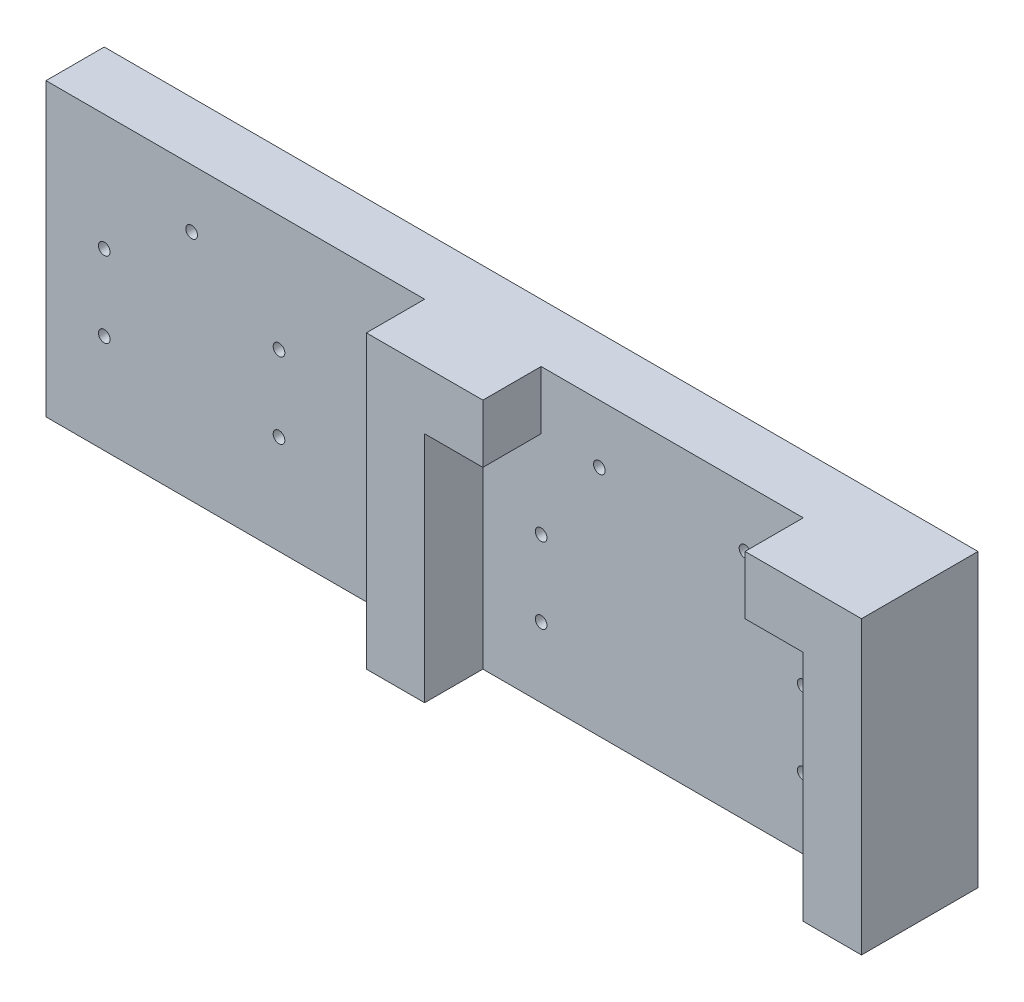
ISO-10303-21;
HEADER;
FILE_DESCRIPTION(('STEP AP214'),'2;1');
FILE_NAME('part.step','',(''),(''),'','','');
FILE_SCHEMA(('AUTOMOTIVE_DESIGN { 1 0 10303 214 1 1 1 1 }'));
ENDSEC;
DATA;
#1=APPLICATION_CONTEXT('core data for automotive mechanical design processes');
#2=APPLICATION_PROTOCOL_DEFINITION('international standard','automotive_design',2000,#1);
#3=PRODUCT_CONTEXT('',#1,'mechanical');
#4=PRODUCT('Part','Part','',(#3));
#5=PRODUCT_RELATED_PRODUCT_CATEGORY('part','',(#4));
#6=PRODUCT_DEFINITION_FORMATION('','',#4);
#7=PRODUCT_DEFINITION_CONTEXT('part definition',#1,'design');
#8=PRODUCT_DEFINITION('design','',#6,#7);
#9=PRODUCT_DEFINITION_SHAPE('','',#8);
#10=(LENGTH_UNIT() NAMED_UNIT(*) SI_UNIT(.MILLI.,.METRE.));
#11=(NAMED_UNIT(*) PLANE_ANGLE_UNIT() SI_UNIT($,.RADIAN.));
#12=(NAMED_UNIT(*) SI_UNIT($,.STERADIAN.) SOLID_ANGLE_UNIT());
#13=UNCERTAINTY_MEASURE_WITH_UNIT(LENGTH_MEASURE(1.E-05),#10,'distance_accuracy_value','');
#14=(GEOMETRIC_REPRESENTATION_CONTEXT(3) GLOBAL_UNCERTAINTY_ASSIGNED_CONTEXT((#13)) GLOBAL_UNIT_ASSIGNED_CONTEXT((#10,
#11,#12)) REPRESENTATION_CONTEXT('',''));
#15=CARTESIAN_POINT('',(0.,0.,0.));
#16=DIRECTION('',(0.,0.,1.));
#17=DIRECTION('',(1.,0.,0.));
#18=AXIS2_PLACEMENT_3D('',#15,#16,#17);
#19=CARTESIAN_POINT('',(0.,0.,-20.));
#20=DIRECTION('',(0.,0.,1.));
#21=DIRECTION('',(1.,0.,0.));
#22=AXIS2_PLACEMENT_3D('',#19,#20,#21);
#23=PLANE('',#22);
#24=CARTESIAN_POINT('',(-1.14143416171165,-128.46417829769,-20.));
#25=DIRECTION('',(0.,0.,-1.));
#26=DIRECTION('',(-1.,0.,0.));
#27=AXIS2_PLACEMENT_3D('',#24,#25,#26);
#28=CIRCLE('',#27,1.);
#29=CARTESIAN_POINT('',(-2.14143416171165,-128.46417829769,-20.));
#30=VERTEX_POINT('',#29);
#31=EDGE_CURVE('E245',#30,#30,#28,.T.);
#32=ORIENTED_EDGE('',*,*,#31,.T.);
#33=EDGE_LOOP('',(#32));
#34=FACE_BOUND('',#33,.T.);
#35=CARTESIAN_POINT('',(8.85856583828836,-100.46417829769,-20.));
#36=DIRECTION('',(0.,0.,-1.));
#37=DIRECTION('',(-1.,0.,0.));
#38=AXIS2_PLACEMENT_3D('',#35,#36,#37);
#39=CIRCLE('',#38,0.999999999999997);
#40=CARTESIAN_POINT('',(7.85856583828836,-100.46417829769,-20.));
#41=VERTEX_POINT('',#40);
#42=EDGE_CURVE('E257',#41,#41,#39,.T.);
#43=ORIENTED_EDGE('',*,*,#42,.T.);
#44=EDGE_LOOP('',(#43));
#45=FACE_BOUND('',#44,.T.);
#46=CARTESIAN_POINT('',(43.8585658382884,-115.46417829769,-20.));
#47=DIRECTION('',(0.,0.,-1.));
#48=DIRECTION('',(-1.,0.,0.));
#49=AXIS2_PLACEMENT_3D('',#46,#47,#48);
#50=CIRCLE('',#49,0.999999999999998);
#51=CARTESIAN_POINT('',(42.8585658382884,-115.46417829769,-20.));
#52=VERTEX_POINT('',#51);
#53=EDGE_CURVE('E269',#52,#52,#50,.T.);
#54=ORIENTED_EDGE('',*,*,#53,.T.);
#55=EDGE_LOOP('',(#54));
#56=FACE_BOUND('',#55,.T.);
#57=CARTESIAN_POINT('',(43.8585658382884,-128.46417829769,-20.));
#58=DIRECTION('',(0.,0.,-1.));
#59=DIRECTION('',(-1.,0.,0.));
#60=AXIS2_PLACEMENT_3D('',#57,#58,#59);
#61=CIRCLE('',#60,1.00000000000001);
#62=CARTESIAN_POINT('',(42.8585658382884,-128.46417829769,-20.));
#63=VERTEX_POINT('',#62);
#64=EDGE_CURVE('E275',#63,#63,#61,.T.);
#65=ORIENTED_EDGE('',*,*,#64,.T.);
#66=EDGE_LOOP('',(#65));
#67=FACE_BOUND('',#66,.T.);
#68=CARTESIAN_POINT('',(33.8585658382884,-100.46417829769,-20.));
#69=DIRECTION('',(0.,0.,-1.));
#70=DIRECTION('',(-1.,0.,0.));
#71=AXIS2_PLACEMENT_3D('',#68,#69,#70);
#72=CIRCLE('',#71,1.00000000000001);
#73=CARTESIAN_POINT('',(32.8585658382884,-100.46417829769,-20.));
#74=VERTEX_POINT('',#73);
#75=EDGE_CURVE('E263',#74,#74,#72,.T.);
#76=ORIENTED_EDGE('',*,*,#75,.T.);
#77=EDGE_LOOP('',(#76));
#78=FACE_BOUND('',#77,.T.);
#79=CARTESIAN_POINT('',(-1.14143416171163,-115.46417829769,-20.));
#80=DIRECTION('',(0.,0.,-1.));
#81=DIRECTION('',(-1.,0.,0.));
#82=AXIS2_PLACEMENT_3D('',#79,#80,#81);
#83=CIRCLE('',#82,0.999999999999999);
#84=CARTESIAN_POINT('',(-2.14143416171163,-115.46417829769,-20.));
#85=VERTEX_POINT('',#84);
#86=EDGE_CURVE('E251',#85,#85,#83,.T.);
#87=ORIENTED_EDGE('',*,*,#86,.T.);
#88=EDGE_LOOP('',(#87));
#89=FACE_BOUND('',#88,.T.);
#90=DIRECTION('',(1.,0.,0.));
#91=VECTOR('',#90,1.);
#92=CARTESIAN_POINT('',(0.,-100.46417829769,-20.));
#93=LINE('',#92,#91);
#94=CARTESIAN_POINT('',(43.8585658382884,-100.46417829769,-20.));
#95=VERTEX_POINT('',#94);
#96=CARTESIAN_POINT('',(53.8585658382884,-100.46417829769,-20.));
#97=VERTEX_POINT('',#96);
#98=EDGE_CURVE('E398',#95,#97,#93,.T.);
#99=ORIENTED_EDGE('',*,*,#98,.F.);
#100=DIRECTION('',(0.,-1.,0.));
#101=VECTOR('',#100,1.);
#102=CARTESIAN_POINT('',(43.8585658382883,0.,-20.));
#103=LINE('',#102,#101);
#104=CARTESIAN_POINT('',(43.8585658382884,-90.4641782976895,-20.));
#105=VERTEX_POINT('',#104);
#106=EDGE_CURVE('E173',#105,#95,#103,.T.);
#107=ORIENTED_EDGE('',*,*,#106,.F.);
#108=DIRECTION('',(1.,0.,0.));
#109=VECTOR('',#108,1.);
#110=CARTESIAN_POINT('',(63.8585658382884,-90.4641782976895,-20.));
#111=LINE('',#110,#109);
#112=CARTESIAN_POINT('',(-1.14143416171164,-90.4641782976895,-20.));
#113=VERTEX_POINT('',#112);
#114=EDGE_CURVE('E295',#113,#105,#111,.T.);
#115=ORIENTED_EDGE('',*,*,#114,.F.);
#116=DIRECTION('',(0.,-1.,0.));
#117=VECTOR('',#116,1.);
#118=CARTESIAN_POINT('',(-1.14143416171166,0.,-20.));
#119=LINE('',#118,#117);
#120=CARTESIAN_POINT('',(-1.14143416171164,-100.46417829769,-20.));
#121=VERTEX_POINT('',#120);
#122=EDGE_CURVE('E176',#113,#121,#119,.T.);
#123=ORIENTED_EDGE('',*,*,#122,.T.);
#124=DIRECTION('',(-1.,0.,0.));
#125=VECTOR('',#124,1.);
#126=CARTESIAN_POINT('',(0.,-100.46417829769,-20.));
#127=LINE('',#126,#125);
#128=CARTESIAN_POINT('',(-11.1414341617116,-100.46417829769,-20.));
#129=VERTEX_POINT('',#128);
#130=EDGE_CURVE('E54',#121,#129,#127,.T.);
#131=ORIENTED_EDGE('',*,*,#130,.T.);
#132=DIRECTION('',(0.,1.,0.));
#133=VECTOR('',#132,1.);
#134=CARTESIAN_POINT('',(-11.1414341617116,0.,-20.));
#135=LINE('',#134,#133);
#136=CARTESIAN_POINT('',(-11.1414341617116,-140.464178297689,-20.));
#137=VERTEX_POINT('',#136);
#138=EDGE_CURVE('E186',#137,#129,#135,.T.);
#139=ORIENTED_EDGE('',*,*,#138,.F.);
#140=DIRECTION('',(-1.,0.,0.));
#141=VECTOR('',#140,1.);
#142=CARTESIAN_POINT('',(63.8585658382884,-140.464178297689,-20.));
#143=LINE('',#142,#141);
#144=CARTESIAN_POINT('',(53.8585658382884,-140.464178297689,-20.));
#145=VERTEX_POINT('',#144);
#146=EDGE_CURVE('E292',#145,#137,#143,.T.);
#147=ORIENTED_EDGE('',*,*,#146,.F.);
#148=DIRECTION('',(0.,1.,0.));
#149=VECTOR('',#148,1.);
#150=CARTESIAN_POINT('',(53.8585658382884,0.,-20.));
#151=LINE('',#150,#149);
#152=EDGE_CURVE('E169',#145,#97,#151,.T.);
#153=ORIENTED_EDGE('',*,*,#152,.T.);
#154=EDGE_LOOP('',(#99,#107,#115,#123,#131,#139,#147,#153));
#155=FACE_BOUND('',#154,.T.);
#156=ADVANCED_FACE('F39',(#34,#45,#56,#67,#78,#89,#155),#23,.T.);
#157=DIRECTION('',(0.,-1.,0.));
#158=VECTOR('',#157,1.);
#159=CARTESIAN_POINT('',(-21.1414341617116,0.,-20.));
#160=LINE('',#159,#158);
#161=CARTESIAN_POINT('',(-21.1414341617116,-90.4641782976895,-20.));
#162=VERTEX_POINT('',#161);
#163=CARTESIAN_POINT('',(-21.1414341617116,-140.464178297689,-20.));
#164=VERTEX_POINT('',#163);
#165=EDGE_CURVE('E200',#162,#164,#160,.T.);
#166=ORIENTED_EDGE('',*,*,#165,.F.);
#167=CARTESIAN_POINT('',(-86.1414341617116,-90.4641782976895,-20.));
#168=VERTEX_POINT('',#167);
#169=EDGE_CURVE('E286',#168,#162,#111,.T.);
#170=ORIENTED_EDGE('',*,*,#169,.F.);
#171=DIRECTION('',(0.,1.,0.));
#172=VECTOR('',#171,1.);
#173=CARTESIAN_POINT('',(-86.1414341617116,-140.464178297689,-20.));
#174=LINE('',#173,#172);
#175=CARTESIAN_POINT('',(-86.1414341617116,-140.464178297689,-20.));
#176=VERTEX_POINT('',#175);
#177=EDGE_CURVE('E79',#176,#168,#174,.T.);
#178=ORIENTED_EDGE('',*,*,#177,.F.);
#179=EDGE_CURVE('E281',#164,#176,#143,.T.);
#180=ORIENTED_EDGE('',*,*,#179,.F.);
#181=EDGE_LOOP('',(#166,#170,#178,#180));
#182=FACE_BOUND('',#181,.T.);
#183=CARTESIAN_POINT('',(-76.1414341617116,-123.464178297689,-20.));
#184=DIRECTION('',(0.,0.,-1.));
#185=DIRECTION('',(-1.,0.,0.));
#186=AXIS2_PLACEMENT_3D('',#183,#184,#185);
#187=CIRCLE('',#186,0.999999999999998);
#188=CARTESIAN_POINT('',(-77.1414341617116,-123.464178297689,-20.));
#189=VERTEX_POINT('',#188);
#190=EDGE_CURVE('E217',#189,#189,#187,.T.);
#191=ORIENTED_EDGE('',*,*,#190,.T.);
#192=EDGE_LOOP('',(#191));
#193=FACE_BOUND('',#192,.T.);
#194=CARTESIAN_POINT('',(-61.1414341617116,-100.464178297689,-20.));
#195=DIRECTION('',(0.,0.,-1.));
#196=DIRECTION('',(-1.,0.,0.));
#197=AXIS2_PLACEMENT_3D('',#194,#195,#196);
#198=CIRCLE('',#197,0.999999999999998);
#199=CARTESIAN_POINT('',(-62.1414341617116,-100.464178297689,-20.));
#200=VERTEX_POINT('',#199);
#201=EDGE_CURVE('E227',#200,#200,#198,.T.);
#202=ORIENTED_EDGE('',*,*,#201,.T.);
#203=EDGE_LOOP('',(#202));
#204=FACE_BOUND('',#203,.T.);
#205=CARTESIAN_POINT('',(-46.1414341617116,-123.464178297689,-20.));
#206=DIRECTION('',(0.,0.,-1.));
#207=DIRECTION('',(-1.,0.,0.));
#208=AXIS2_PLACEMENT_3D('',#205,#206,#207);
#209=CIRCLE('',#208,0.999999999999998);
#210=CARTESIAN_POINT('',(-47.1414341617116,-123.464178297689,-20.));
#211=VERTEX_POINT('',#210);
#212=EDGE_CURVE('E239',#211,#211,#209,.T.);
#213=ORIENTED_EDGE('',*,*,#212,.T.);
#214=EDGE_LOOP('',(#213));
#215=FACE_BOUND('',#214,.T.);
#216=CARTESIAN_POINT('',(-46.1414341617116,-110.464178297689,-20.));
#217=DIRECTION('',(0.,0.,-1.));
#218=DIRECTION('',(-1.,0.,0.));
#219=AXIS2_PLACEMENT_3D('',#216,#217,#218);
#220=CIRCLE('',#219,1.00000000000001);
#221=CARTESIAN_POINT('',(-47.1414341617116,-110.464178297689,-20.));
#222=VERTEX_POINT('',#221);
#223=EDGE_CURVE('E233',#222,#222,#220,.T.);
#224=ORIENTED_EDGE('',*,*,#223,.T.);
#225=EDGE_LOOP('',(#224));
#226=FACE_BOUND('',#225,.T.);
#227=CARTESIAN_POINT('',(-76.1414341617116,-110.464178297689,-20.));
#228=DIRECTION('',(0.,0.,-1.));
#229=DIRECTION('',(-1.,0.,0.));
#230=AXIS2_PLACEMENT_3D('',#227,#228,#229);
#231=CIRCLE('',#230,1.00000000000001);
#232=CARTESIAN_POINT('',(-77.1414341617116,-110.464178297689,-20.));
#233=VERTEX_POINT('',#232);
#234=EDGE_CURVE('E221',#233,#233,#231,.T.);
#235=ORIENTED_EDGE('',*,*,#234,.T.);
#236=EDGE_LOOP('',(#235));
#237=FACE_BOUND('',#236,.T.);
#238=ADVANCED_FACE('F306',(#182,#193,#204,#215,#226,#237),#23,.T.);
#239=CARTESIAN_POINT('',(0.,0.,-30.));
#240=DIRECTION('',(0.,0.,1.));
#241=DIRECTION('',(1.,0.,0.));
#242=AXIS2_PLACEMENT_3D('',#239,#240,#241);
#243=PLANE('',#242);
#244=DIRECTION('',(0.,-1.,0.));
#245=VECTOR('',#244,1.);
#246=CARTESIAN_POINT('',(63.8585658382884,-140.464178297689,-30.));
#247=LINE('',#246,#245);
#248=CARTESIAN_POINT('',(63.8585658382884,-90.4641782976895,-30.));
#249=VERTEX_POINT('',#248);
#250=CARTESIAN_POINT('',(63.8585658382884,-140.464178297689,-30.));
#251=VERTEX_POINT('',#250);
#252=EDGE_CURVE('E284',#249,#251,#247,.T.);
#253=ORIENTED_EDGE('',*,*,#252,.T.);
#254=DIRECTION('',(-1.,0.,0.));
#255=VECTOR('',#254,1.);
#256=CARTESIAN_POINT('',(63.8585658382884,-140.464178297689,-30.));
#257=LINE('',#256,#255);
#258=CARTESIAN_POINT('',(-86.1414341617116,-140.464178297689,-30.));
#259=VERTEX_POINT('',#258);
#260=EDGE_CURVE('E86',#251,#259,#257,.T.);
#261=ORIENTED_EDGE('',*,*,#260,.T.);
#262=DIRECTION('',(0.,1.,0.));
#263=VECTOR('',#262,1.);
#264=CARTESIAN_POINT('',(-86.1414341617116,-140.464178297689,-30.));
#265=LINE('',#264,#263);
#266=CARTESIAN_POINT('',(-86.1414341617116,-90.4641782976895,-30.));
#267=VERTEX_POINT('',#266);
#268=EDGE_CURVE('E288',#259,#267,#265,.T.);
#269=ORIENTED_EDGE('',*,*,#268,.T.);
#270=DIRECTION('',(1.,0.,0.));
#271=VECTOR('',#270,1.);
#272=CARTESIAN_POINT('',(63.8585658382884,-90.4641782976895,-30.));
#273=LINE('',#272,#271);
#274=EDGE_CURVE('E63',#267,#249,#273,.T.);
#275=ORIENTED_EDGE('',*,*,#274,.T.);
#276=EDGE_LOOP('',(#253,#261,#269,#275));
#277=FACE_BOUND('',#276,.T.);
#278=CARTESIAN_POINT('',(43.8585658382884,-128.46417829769,-30.));
#279=DIRECTION('',(0.,0.,-1.));
#280=DIRECTION('',(-1.,0.,0.));
#281=AXIS2_PLACEMENT_3D('',#278,#279,#280);
#282=CIRCLE('',#281,1.00000000000001);
#283=CARTESIAN_POINT('',(42.8585658382884,-128.46417829769,-30.));
#284=VERTEX_POINT('',#283);
#285=EDGE_CURVE('E278',#284,#284,#282,.T.);
#286=ORIENTED_EDGE('',*,*,#285,.F.);
#287=EDGE_LOOP('',(#286));
#288=FACE_BOUND('',#287,.T.);
#289=CARTESIAN_POINT('',(43.8585658382884,-115.46417829769,-30.));
#290=DIRECTION('',(0.,0.,-1.));
#291=DIRECTION('',(-1.,0.,0.));
#292=AXIS2_PLACEMENT_3D('',#289,#290,#291);
#293=CIRCLE('',#292,0.999999999999998);
#294=CARTESIAN_POINT('',(42.8585658382884,-115.46417829769,-30.));
#295=VERTEX_POINT('',#294);
#296=EDGE_CURVE('E272',#295,#295,#293,.T.);
#297=ORIENTED_EDGE('',*,*,#296,.F.);
#298=EDGE_LOOP('',(#297));
#299=FACE_BOUND('',#298,.T.);
#300=CARTESIAN_POINT('',(33.8585658382884,-100.46417829769,-30.));
#301=DIRECTION('',(0.,0.,-1.));
#302=DIRECTION('',(-1.,0.,0.));
#303=AXIS2_PLACEMENT_3D('',#300,#301,#302);
#304=CIRCLE('',#303,1.00000000000001);
#305=CARTESIAN_POINT('',(32.8585658382884,-100.46417829769,-30.));
#306=VERTEX_POINT('',#305);
#307=EDGE_CURVE('E266',#306,#306,#304,.T.);
#308=ORIENTED_EDGE('',*,*,#307,.F.);
#309=EDGE_LOOP('',(#308));
#310=FACE_BOUND('',#309,.T.);
#311=CARTESIAN_POINT('',(8.85856583828836,-100.46417829769,-30.));
#312=DIRECTION('',(0.,0.,-1.));
#313=DIRECTION('',(-1.,0.,0.));
#314=AXIS2_PLACEMENT_3D('',#311,#312,#313);
#315=CIRCLE('',#314,0.999999999999997);
#316=CARTESIAN_POINT('',(7.85856583828836,-100.46417829769,-30.));
#317=VERTEX_POINT('',#316);
#318=EDGE_CURVE('E260',#317,#317,#315,.T.);
#319=ORIENTED_EDGE('',*,*,#318,.F.);
#320=EDGE_LOOP('',(#319));
#321=FACE_BOUND('',#320,.T.);
#322=CARTESIAN_POINT('',(-1.14143416171163,-115.46417829769,-30.));
#323=DIRECTION('',(0.,0.,-1.));
#324=DIRECTION('',(-1.,0.,0.));
#325=AXIS2_PLACEMENT_3D('',#322,#323,#324);
#326=CIRCLE('',#325,0.999999999999999);
#327=CARTESIAN_POINT('',(-2.14143416171163,-115.46417829769,-30.));
#328=VERTEX_POINT('',#327);
#329=EDGE_CURVE('E254',#328,#328,#326,.T.);
#330=ORIENTED_EDGE('',*,*,#329,.F.);
#331=EDGE_LOOP('',(#330));
#332=FACE_BOUND('',#331,.T.);
#333=CARTESIAN_POINT('',(-1.14143416171165,-128.46417829769,-30.));
#334=DIRECTION('',(0.,0.,-1.));
#335=DIRECTION('',(-1.,0.,0.));
#336=AXIS2_PLACEMENT_3D('',#333,#334,#335);
#337=CIRCLE('',#336,1.);
#338=CARTESIAN_POINT('',(-2.14143416171165,-128.46417829769,-30.));
#339=VERTEX_POINT('',#338);
#340=EDGE_CURVE('E248',#339,#339,#337,.T.);
#341=ORIENTED_EDGE('',*,*,#340,.F.);
#342=EDGE_LOOP('',(#341));
#343=FACE_BOUND('',#342,.T.);
#344=CARTESIAN_POINT('',(-46.1414341617116,-123.464178297689,-30.));
#345=DIRECTION('',(0.,0.,-1.));
#346=DIRECTION('',(-1.,0.,0.));
#347=AXIS2_PLACEMENT_3D('',#344,#345,#346);
#348=CIRCLE('',#347,0.999999999999998);
#349=CARTESIAN_POINT('',(-47.1414341617116,-123.464178297689,-30.));
#350=VERTEX_POINT('',#349);
#351=EDGE_CURVE('E242',#350,#350,#348,.T.);
#352=ORIENTED_EDGE('',*,*,#351,.F.);
#353=EDGE_LOOP('',(#352));
#354=FACE_BOUND('',#353,.T.);
#355=CARTESIAN_POINT('',(-46.1414341617116,-110.464178297689,-30.));
#356=DIRECTION('',(0.,0.,-1.));
#357=DIRECTION('',(-1.,0.,0.));
#358=AXIS2_PLACEMENT_3D('',#355,#356,#357);
#359=CIRCLE('',#358,1.00000000000001);
#360=CARTESIAN_POINT('',(-47.1414341617116,-110.464178297689,-30.));
#361=VERTEX_POINT('',#360);
#362=EDGE_CURVE('E236',#361,#361,#359,.T.);
#363=ORIENTED_EDGE('',*,*,#362,.F.);
#364=EDGE_LOOP('',(#363));
#365=FACE_BOUND('',#364,.T.);
#366=CARTESIAN_POINT('',(-61.1414341617116,-100.464178297689,-30.));
#367=DIRECTION('',(0.,0.,-1.));
#368=DIRECTION('',(-1.,0.,0.));
#369=AXIS2_PLACEMENT_3D('',#366,#367,#368);
#370=CIRCLE('',#369,0.999999999999998);
#371=CARTESIAN_POINT('',(-62.1414341617116,-100.464178297689,-30.));
#372=VERTEX_POINT('',#371);
#373=EDGE_CURVE('E230',#372,#372,#370,.T.);
#374=ORIENTED_EDGE('',*,*,#373,.F.);
#375=EDGE_LOOP('',(#374));
#376=FACE_BOUND('',#375,.T.);
#377=CARTESIAN_POINT('',(-76.1414341617116,-110.464178297689,-30.));
#378=DIRECTION('',(0.,0.,-1.));
#379=DIRECTION('',(-1.,0.,0.));
#380=AXIS2_PLACEMENT_3D('',#377,#378,#379);
#381=CIRCLE('',#380,1.00000000000001);
#382=CARTESIAN_POINT('',(-77.1414341617116,-110.464178297689,-30.));
#383=VERTEX_POINT('',#382);
#384=EDGE_CURVE('E224',#383,#383,#381,.T.);
#385=ORIENTED_EDGE('',*,*,#384,.F.);
#386=EDGE_LOOP('',(#385));
#387=FACE_BOUND('',#386,.T.);
#388=CARTESIAN_POINT('',(-76.1414341617116,-123.464178297689,-30.));
#389=DIRECTION('',(0.,0.,-1.));
#390=DIRECTION('',(-1.,0.,0.));
#391=AXIS2_PLACEMENT_3D('',#388,#389,#390);
#392=CIRCLE('',#391,0.999999999999998);
#393=CARTESIAN_POINT('',(-77.1414341617116,-123.464178297689,-30.));
#394=VERTEX_POINT('',#393);
#395=EDGE_CURVE('E218',#394,#394,#392,.T.);
#396=ORIENTED_EDGE('',*,*,#395,.F.);
#397=EDGE_LOOP('',(#396));
#398=FACE_BOUND('',#397,.T.);
#399=ADVANCED_FACE('F317',(#277,#288,#299,#310,#321,#332,#343,#354,#365,#376,#387,#398),#243,.F.);
#400=CARTESIAN_POINT('',(63.8585658382884,-140.464178297689,-30.));
#401=DIRECTION('',(-1.,0.,0.));
#402=DIRECTION('',(0.,-1.,0.));
#403=AXIS2_PLACEMENT_3D('',#400,#401,#402);
#404=PLANE('',#403);
#405=DIRECTION('',(0.,0.,1.));
#406=VECTOR('',#405,1.);
#407=CARTESIAN_POINT('',(63.8585658382884,-90.4641782976895,-30.));
#408=LINE('',#407,#406);
#409=CARTESIAN_POINT('',(63.8585658382884,-90.4641782976895,-10.));
#410=VERTEX_POINT('',#409);
#411=EDGE_CURVE('E291',#249,#410,#408,.T.);
#412=ORIENTED_EDGE('',*,*,#411,.T.);
#413=DIRECTION('',(0.,1.,0.));
#414=VECTOR('',#413,1.);
#415=CARTESIAN_POINT('',(63.8585658382884,0.,-10.));
#416=LINE('',#415,#414);
#417=CARTESIAN_POINT('',(63.8585658382884,-140.464178297689,-10.));
#418=VERTEX_POINT('',#417);
#419=EDGE_CURVE('E390',#418,#410,#416,.T.);
#420=ORIENTED_EDGE('',*,*,#419,.F.);
#421=DIRECTION('',(0.,0.,1.));
#422=VECTOR('',#421,1.);
#423=CARTESIAN_POINT('',(63.8585658382884,-140.464178297689,-30.));
#424=LINE('',#423,#422);
#425=EDGE_CURVE('E11',#251,#418,#424,.T.);
#426=ORIENTED_EDGE('',*,*,#425,.F.);
#427=ORIENTED_EDGE('',*,*,#252,.F.);
#428=EDGE_LOOP('',(#412,#420,#426,#427));
#429=FACE_BOUND('',#428,.T.);
#430=ADVANCED_FACE('F41',(#429),#404,.F.);
#431=CARTESIAN_POINT('',(63.8585658382884,-140.464178297689,-30.));
#432=DIRECTION('',(0.,1.,0.));
#433=DIRECTION('',(0.,0.,1.));
#434=AXIS2_PLACEMENT_3D('',#431,#432,#433);
#435=PLANE('',#434);
#436=ORIENTED_EDGE('',*,*,#425,.T.);
#437=DIRECTION('',(1.,0.,0.));
#438=VECTOR('',#437,1.);
#439=CARTESIAN_POINT('',(0.,-140.464178297689,-10.));
#440=LINE('',#439,#438);
#441=CARTESIAN_POINT('',(53.8585658382884,-140.464178297689,-10.));
#442=VERTEX_POINT('',#441);
#443=EDGE_CURVE('E389',#442,#418,#440,.T.);
#444=ORIENTED_EDGE('',*,*,#443,.F.);
#445=DIRECTION('',(0.,0.,-1.));
#446=VECTOR('',#445,1.);
#447=CARTESIAN_POINT('',(53.8585658382884,-140.464178297689,-10.));
#448=LINE('',#447,#446);
#449=EDGE_CURVE('E178',#442,#145,#448,.T.);
#450=ORIENTED_EDGE('',*,*,#449,.T.);
#451=ORIENTED_EDGE('',*,*,#146,.T.);
#452=DIRECTION('',(0.,0.,-1.));
#453=VECTOR('',#452,1.);
#454=CARTESIAN_POINT('',(-11.1414341617116,-140.464178297689,-10.));
#455=LINE('',#454,#453);
#456=CARTESIAN_POINT('',(-11.1414341617116,-140.464178297689,-10.));
#457=VERTEX_POINT('',#456);
#458=EDGE_CURVE('E205',#457,#137,#455,.T.);
#459=ORIENTED_EDGE('',*,*,#458,.F.);
#460=DIRECTION('',(1.,0.,0.));
#461=VECTOR('',#460,1.);
#462=CARTESIAN_POINT('',(0.,-140.464178297689,-10.));
#463=LINE('',#462,#461);
#464=CARTESIAN_POINT('',(-21.1414341617116,-140.464178297689,-10.));
#465=VERTEX_POINT('',#464);
#466=EDGE_CURVE('E193',#465,#457,#463,.T.);
#467=ORIENTED_EDGE('',*,*,#466,.F.);
#468=DIRECTION('',(0.,0.,-1.));
#469=VECTOR('',#468,1.);
#470=CARTESIAN_POINT('',(-21.1414341617116,-140.464178297689,-10.));
#471=LINE('',#470,#469);
#472=EDGE_CURVE('E208',#465,#164,#471,.T.);
#473=ORIENTED_EDGE('',*,*,#472,.T.);
#474=ORIENTED_EDGE('',*,*,#179,.T.);
#475=DIRECTION('',(0.,0.,1.));
#476=VECTOR('',#475,1.);
#477=CARTESIAN_POINT('',(-86.1414341617116,-140.464178297689,-30.));
#478=LINE('',#477,#476);
#479=EDGE_CURVE('E47',#259,#176,#478,.T.);
#480=ORIENTED_EDGE('',*,*,#479,.F.);
#481=ORIENTED_EDGE('',*,*,#260,.F.);
#482=EDGE_LOOP('',(#436,#444,#450,#451,#459,#467,#473,#474,#480,#481));
#483=FACE_BOUND('',#482,.T.);
#484=ADVANCED_FACE('F382',(#483),#435,.F.);
#485=CARTESIAN_POINT('',(-86.1414341617116,-140.464178297689,-30.));
#486=DIRECTION('',(1.,0.,0.));
#487=DIRECTION('',(0.,1.,0.));
#488=AXIS2_PLACEMENT_3D('',#485,#486,#487);
#489=PLANE('',#488);
#490=ORIENTED_EDGE('',*,*,#177,.T.);
#491=DIRECTION('',(0.,0.,1.));
#492=VECTOR('',#491,1.);
#493=CARTESIAN_POINT('',(-86.1414341617116,-90.4641782976895,-30.));
#494=LINE('',#493,#492);
#495=EDGE_CURVE('E299',#267,#168,#494,.T.);
#496=ORIENTED_EDGE('',*,*,#495,.F.);
#497=ORIENTED_EDGE('',*,*,#268,.F.);
#498=ORIENTED_EDGE('',*,*,#479,.T.);
#499=EDGE_LOOP('',(#490,#496,#497,#498));
#500=FACE_BOUND('',#499,.T.);
#501=ADVANCED_FACE('F301',(#500),#489,.F.);
#502=CARTESIAN_POINT('',(63.8585658382884,-90.4641782976895,-30.));
#503=DIRECTION('',(0.,-1.,0.));
#504=DIRECTION('',(0.,0.,-1.));
#505=AXIS2_PLACEMENT_3D('',#502,#503,#504);
#506=PLANE('',#505);
#507=ORIENTED_EDGE('',*,*,#169,.T.);
#508=DIRECTION('',(0.,0.,-1.));
#509=VECTOR('',#508,1.);
#510=CARTESIAN_POINT('',(-21.1414341617116,-90.4641782976895,-10.));
#511=LINE('',#510,#509);
#512=CARTESIAN_POINT('',(-21.1414341617116,-90.4641782976895,-10.));
#513=VERTEX_POINT('',#512);
#514=EDGE_CURVE('E211',#513,#162,#511,.T.);
#515=ORIENTED_EDGE('',*,*,#514,.F.);
#516=DIRECTION('',(-1.,0.,0.));
#517=VECTOR('',#516,1.);
#518=CARTESIAN_POINT('',(0.,-90.4641782976895,-10.));
#519=LINE('',#518,#517);
#520=CARTESIAN_POINT('',(-1.14143416171164,-90.4641782976895,-10.));
#521=VERTEX_POINT('',#520);
#522=EDGE_CURVE('E189',#521,#513,#519,.T.);
#523=ORIENTED_EDGE('',*,*,#522,.F.);
#524=DIRECTION('',(0.,0.,-1.));
#525=VECTOR('',#524,1.);
#526=CARTESIAN_POINT('',(-1.14143416171164,-90.4641782976895,-10.));
#527=LINE('',#526,#525);
#528=EDGE_CURVE('E213',#521,#113,#527,.T.);
#529=ORIENTED_EDGE('',*,*,#528,.T.);
#530=ORIENTED_EDGE('',*,*,#114,.T.);
#531=DIRECTION('',(0.,0.,-1.));
#532=VECTOR('',#531,1.);
#533=CARTESIAN_POINT('',(43.8585658382884,-90.4641782976895,-10.));
#534=LINE('',#533,#532);
#535=CARTESIAN_POINT('',(43.8585658382884,-90.4641782976895,-10.));
#536=VERTEX_POINT('',#535);
#537=EDGE_CURVE('E393',#536,#105,#534,.T.);
#538=ORIENTED_EDGE('',*,*,#537,.F.);
#539=DIRECTION('',(-1.,0.,0.));
#540=VECTOR('',#539,1.);
#541=CARTESIAN_POINT('',(0.,-90.4641782976895,-10.));
#542=LINE('',#541,#540);
#543=EDGE_CURVE('E166',#410,#536,#542,.T.);
#544=ORIENTED_EDGE('',*,*,#543,.F.);
#545=ORIENTED_EDGE('',*,*,#411,.F.);
#546=ORIENTED_EDGE('',*,*,#274,.F.);
#547=ORIENTED_EDGE('',*,*,#495,.T.);
#548=EDGE_LOOP('',(#507,#515,#523,#529,#530,#538,#544,#545,#546,#547));
#549=FACE_BOUND('',#548,.T.);
#550=ADVANCED_FACE('F310',(#549),#506,.F.);
#551=CARTESIAN_POINT('',(43.8585658382884,-128.46417829769,-30.));
#552=DIRECTION('',(0.,0.,1.));
#553=DIRECTION('',(1.,0.,0.));
#554=AXIS2_PLACEMENT_3D('',#551,#552,#553);
#555=CYLINDRICAL_SURFACE('',#554,1.00000000000001);
#556=ORIENTED_EDGE('',*,*,#285,.T.);
#557=EDGE_LOOP('',(#556));
#558=FACE_BOUND('',#557,.T.);
#559=ORIENTED_EDGE('',*,*,#64,.F.);
#560=EDGE_LOOP('',(#559));
#561=FACE_BOUND('',#560,.T.);
#562=ADVANCED_FACE('F380',(#558,#561),#555,.F.);
#563=CARTESIAN_POINT('',(43.8585658382884,-115.46417829769,-30.));
#564=DIRECTION('',(0.,0.,1.));
#565=DIRECTION('',(1.,0.,0.));
#566=AXIS2_PLACEMENT_3D('',#563,#564,#565);
#567=CYLINDRICAL_SURFACE('',#566,0.999999999999998);
#568=ORIENTED_EDGE('',*,*,#296,.T.);
#569=EDGE_LOOP('',(#568));
#570=FACE_BOUND('',#569,.T.);
#571=ORIENTED_EDGE('',*,*,#53,.F.);
#572=EDGE_LOOP('',(#571));
#573=FACE_BOUND('',#572,.T.);
#574=ADVANCED_FACE('F603',(#570,#573),#567,.F.);
#575=CARTESIAN_POINT('',(33.8585658382884,-100.46417829769,-30.));
#576=DIRECTION('',(0.,0.,1.));
#577=DIRECTION('',(1.,0.,0.));
#578=AXIS2_PLACEMENT_3D('',#575,#576,#577);
#579=CYLINDRICAL_SURFACE('',#578,1.00000000000001);
#580=ORIENTED_EDGE('',*,*,#307,.T.);
#581=EDGE_LOOP('',(#580));
#582=FACE_BOUND('',#581,.T.);
#583=ORIENTED_EDGE('',*,*,#75,.F.);
#584=EDGE_LOOP('',(#583));
#585=FACE_BOUND('',#584,.T.);
#586=ADVANCED_FACE('F593',(#582,#585),#579,.F.);
#587=CARTESIAN_POINT('',(8.85856583828836,-100.46417829769,-30.));
#588=DIRECTION('',(0.,0.,1.));
#589=DIRECTION('',(1.,0.,0.));
#590=AXIS2_PLACEMENT_3D('',#587,#588,#589);
#591=CYLINDRICAL_SURFACE('',#590,0.999999999999997);
#592=ORIENTED_EDGE('',*,*,#318,.T.);
#593=EDGE_LOOP('',(#592));
#594=FACE_BOUND('',#593,.T.);
#595=ORIENTED_EDGE('',*,*,#42,.F.);
#596=EDGE_LOOP('',(#595));
#597=FACE_BOUND('',#596,.T.);
#598=ADVANCED_FACE('F583',(#594,#597),#591,.F.);
#599=CARTESIAN_POINT('',(-1.14143416171163,-115.46417829769,-30.));
#600=DIRECTION('',(0.,0.,1.));
#601=DIRECTION('',(1.,0.,0.));
#602=AXIS2_PLACEMENT_3D('',#599,#600,#601);
#603=CYLINDRICAL_SURFACE('',#602,0.999999999999999);
#604=ORIENTED_EDGE('',*,*,#329,.T.);
#605=EDGE_LOOP('',(#604));
#606=FACE_BOUND('',#605,.T.);
#607=ORIENTED_EDGE('',*,*,#86,.F.);
#608=EDGE_LOOP('',(#607));
#609=FACE_BOUND('',#608,.T.);
#610=ADVANCED_FACE('F573',(#606,#609),#603,.F.);
#611=CARTESIAN_POINT('',(-1.14143416171165,-128.46417829769,-30.));
#612=DIRECTION('',(0.,0.,1.));
#613=DIRECTION('',(1.,0.,0.));
#614=AXIS2_PLACEMENT_3D('',#611,#612,#613);
#615=CYLINDRICAL_SURFACE('',#614,1.);
#616=ORIENTED_EDGE('',*,*,#340,.T.);
#617=EDGE_LOOP('',(#616));
#618=FACE_BOUND('',#617,.T.);
#619=ORIENTED_EDGE('',*,*,#31,.F.);
#620=EDGE_LOOP('',(#619));
#621=FACE_BOUND('',#620,.T.);
#622=ADVANCED_FACE('F563',(#618,#621),#615,.F.);
#623=CARTESIAN_POINT('',(-46.1414341617116,-123.464178297689,-30.));
#624=DIRECTION('',(0.,0.,1.));
#625=DIRECTION('',(1.,0.,0.));
#626=AXIS2_PLACEMENT_3D('',#623,#624,#625);
#627=CYLINDRICAL_SURFACE('',#626,0.999999999999998);
#628=ORIENTED_EDGE('',*,*,#351,.T.);
#629=EDGE_LOOP('',(#628));
#630=FACE_BOUND('',#629,.T.);
#631=ORIENTED_EDGE('',*,*,#212,.F.);
#632=EDGE_LOOP('',(#631));
#633=FACE_BOUND('',#632,.T.);
#634=ADVANCED_FACE('F553',(#630,#633),#627,.F.);
#635=CARTESIAN_POINT('',(-46.1414341617116,-110.464178297689,-30.));
#636=DIRECTION('',(0.,0.,1.));
#637=DIRECTION('',(1.,0.,0.));
#638=AXIS2_PLACEMENT_3D('',#635,#636,#637);
#639=CYLINDRICAL_SURFACE('',#638,1.00000000000001);
#640=ORIENTED_EDGE('',*,*,#362,.T.);
#641=EDGE_LOOP('',(#640));
#642=FACE_BOUND('',#641,.T.);
#643=ORIENTED_EDGE('',*,*,#223,.F.);
#644=EDGE_LOOP('',(#643));
#645=FACE_BOUND('',#644,.T.);
#646=ADVANCED_FACE('F368',(#642,#645),#639,.F.);
#647=CARTESIAN_POINT('',(-61.1414341617116,-100.464178297689,-30.));
#648=DIRECTION('',(0.,0.,1.));
#649=DIRECTION('',(1.,0.,0.));
#650=AXIS2_PLACEMENT_3D('',#647,#648,#649);
#651=CYLINDRICAL_SURFACE('',#650,0.999999999999998);
#652=ORIENTED_EDGE('',*,*,#373,.T.);
#653=EDGE_LOOP('',(#652));
#654=FACE_BOUND('',#653,.T.);
#655=ORIENTED_EDGE('',*,*,#201,.F.);
#656=EDGE_LOOP('',(#655));
#657=FACE_BOUND('',#656,.T.);
#658=ADVANCED_FACE('F362',(#654,#657),#651,.F.);
#659=CARTESIAN_POINT('',(-76.1414341617116,-110.464178297689,-30.));
#660=DIRECTION('',(0.,0.,1.));
#661=DIRECTION('',(1.,0.,0.));
#662=AXIS2_PLACEMENT_3D('',#659,#660,#661);
#663=CYLINDRICAL_SURFACE('',#662,1.00000000000001);
#664=ORIENTED_EDGE('',*,*,#384,.T.);
#665=EDGE_LOOP('',(#664));
#666=FACE_BOUND('',#665,.T.);
#667=ORIENTED_EDGE('',*,*,#234,.F.);
#668=EDGE_LOOP('',(#667));
#669=FACE_BOUND('',#668,.T.);
#670=ADVANCED_FACE('F347',(#666,#669),#663,.F.);
#671=CARTESIAN_POINT('',(-76.1414341617116,-123.464178297689,-30.));
#672=DIRECTION('',(0.,0.,1.));
#673=DIRECTION('',(1.,0.,0.));
#674=AXIS2_PLACEMENT_3D('',#671,#672,#673);
#675=CYLINDRICAL_SURFACE('',#674,0.999999999999998);
#676=ORIENTED_EDGE('',*,*,#395,.T.);
#677=EDGE_LOOP('',(#676));
#678=FACE_BOUND('',#677,.T.);
#679=ORIENTED_EDGE('',*,*,#190,.F.);
#680=EDGE_LOOP('',(#679));
#681=FACE_BOUND('',#680,.T.);
#682=ADVANCED_FACE('F343',(#678,#681),#675,.F.);
#683=CARTESIAN_POINT('',(0.,-100.46417829769,-10.));
#684=DIRECTION('',(0.,-1.,0.));
#685=DIRECTION('',(0.,0.,-1.));
#686=AXIS2_PLACEMENT_3D('',#683,#684,#685);
#687=PLANE('',#686);
#688=ORIENTED_EDGE('',*,*,#130,.F.);
#689=DIRECTION('',(0.,0.,-1.));
#690=VECTOR('',#689,1.);
#691=CARTESIAN_POINT('',(-1.14143416171164,-100.46417829769,-10.));
#692=LINE('',#691,#690);
#693=CARTESIAN_POINT('',(-1.14143416171164,-100.46417829769,-10.));
#694=VERTEX_POINT('',#693);
#695=EDGE_CURVE('E215',#694,#121,#692,.T.);
#696=ORIENTED_EDGE('',*,*,#695,.F.);
#697=DIRECTION('',(-1.,0.,0.));
#698=VECTOR('',#697,1.);
#699=CARTESIAN_POINT('',(0.,-100.46417829769,-10.));
#700=LINE('',#699,#698);
#701=CARTESIAN_POINT('',(-11.1414341617116,-100.46417829769,-10.));
#702=VERTEX_POINT('',#701);
#703=EDGE_CURVE('E182',#694,#702,#700,.T.);
#704=ORIENTED_EDGE('',*,*,#703,.T.);
#705=DIRECTION('',(0.,0.,-1.));
#706=VECTOR('',#705,1.);
#707=CARTESIAN_POINT('',(-11.1414341617116,-100.46417829769,-10.));
#708=LINE('',#707,#706);
#709=EDGE_CURVE('E196',#702,#129,#708,.T.);
#710=ORIENTED_EDGE('',*,*,#709,.T.);
#711=EDGE_LOOP('',(#688,#696,#704,#710));
#712=FACE_BOUND('',#711,.T.);
#713=ADVANCED_FACE('F346',(#712),#687,.T.);
#714=CARTESIAN_POINT('',(-1.14143416171166,0.,-10.));
#715=DIRECTION('',(1.,0.,0.));
#716=DIRECTION('',(0.,1.,0.));
#717=AXIS2_PLACEMENT_3D('',#714,#715,#716);
#718=PLANE('',#717);
#719=ORIENTED_EDGE('',*,*,#122,.F.);
#720=ORIENTED_EDGE('',*,*,#528,.F.);
#721=DIRECTION('',(0.,-1.,0.));
#722=VECTOR('',#721,1.);
#723=CARTESIAN_POINT('',(-1.14143416171166,0.,-10.));
#724=LINE('',#723,#722);
#725=EDGE_CURVE('E185',#521,#694,#724,.T.);
#726=ORIENTED_EDGE('',*,*,#725,.T.);
#727=ORIENTED_EDGE('',*,*,#695,.T.);
#728=EDGE_LOOP('',(#719,#720,#726,#727));
#729=FACE_BOUND('',#728,.T.);
#730=ADVANCED_FACE('F422',(#729),#718,.T.);
#731=CARTESIAN_POINT('',(-21.1414341617116,0.,-10.));
#732=DIRECTION('',(1.,0.,0.));
#733=DIRECTION('',(0.,1.,0.));
#734=AXIS2_PLACEMENT_3D('',#731,#732,#733);
#735=PLANE('',#734);
#736=ORIENTED_EDGE('',*,*,#165,.T.);
#737=ORIENTED_EDGE('',*,*,#472,.F.);
#738=DIRECTION('',(0.,-1.,0.));
#739=VECTOR('',#738,1.);
#740=CARTESIAN_POINT('',(-21.1414341617116,0.,-10.));
#741=LINE('',#740,#739);
#742=EDGE_CURVE('E191',#513,#465,#741,.T.);
#743=ORIENTED_EDGE('',*,*,#742,.F.);
#744=ORIENTED_EDGE('',*,*,#514,.T.);
#745=EDGE_LOOP('',(#736,#737,#743,#744));
#746=FACE_BOUND('',#745,.T.);
#747=ADVANCED_FACE('F420',(#746),#735,.F.);
#748=CARTESIAN_POINT('',(-11.1414341617116,0.,-10.));
#749=DIRECTION('',(-1.,0.,0.));
#750=DIRECTION('',(0.,0.,1.));
#751=AXIS2_PLACEMENT_3D('',#748,#749,#750);
#752=PLANE('',#751);
#753=ORIENTED_EDGE('',*,*,#138,.T.);
#754=ORIENTED_EDGE('',*,*,#709,.F.);
#755=DIRECTION('',(0.,1.,0.));
#756=VECTOR('',#755,1.);
#757=CARTESIAN_POINT('',(-11.1414341617116,0.,-10.));
#758=LINE('',#757,#756);
#759=EDGE_CURVE('E195',#457,#702,#758,.T.);
#760=ORIENTED_EDGE('',*,*,#759,.F.);
#761=ORIENTED_EDGE('',*,*,#458,.T.);
#762=EDGE_LOOP('',(#753,#754,#760,#761));
#763=FACE_BOUND('',#762,.T.);
#764=ADVANCED_FACE('F411',(#763),#752,.F.);
#765=CARTESIAN_POINT('',(0.,0.,-10.));
#766=DIRECTION('',(0.,0.,1.));
#767=DIRECTION('',(1.,0.,0.));
#768=AXIS2_PLACEMENT_3D('',#765,#766,#767);
#769=PLANE('',#768);
#770=ORIENTED_EDGE('',*,*,#703,.F.);
#771=ORIENTED_EDGE('',*,*,#725,.F.);
#772=ORIENTED_EDGE('',*,*,#522,.T.);
#773=ORIENTED_EDGE('',*,*,#742,.T.);
#774=ORIENTED_EDGE('',*,*,#466,.T.);
#775=ORIENTED_EDGE('',*,*,#759,.T.);
#776=EDGE_LOOP('',(#770,#771,#772,#773,#774,#775));
#777=FACE_BOUND('',#776,.T.);
#778=ADVANCED_FACE('F417',(#777),#769,.T.);
#779=CARTESIAN_POINT('',(43.8585658382883,0.,-10.));
#780=DIRECTION('',(1.,0.,0.));
#781=DIRECTION('',(0.,1.,0.));
#782=AXIS2_PLACEMENT_3D('',#779,#780,#781);
#783=PLANE('',#782);
#784=ORIENTED_EDGE('',*,*,#106,.T.);
#785=DIRECTION('',(0.,0.,-1.));
#786=VECTOR('',#785,1.);
#787=CARTESIAN_POINT('',(43.8585658382884,-100.46417829769,-10.));
#788=LINE('',#787,#786);
#789=CARTESIAN_POINT('',(43.8585658382884,-100.46417829769,-10.));
#790=VERTEX_POINT('',#789);
#791=EDGE_CURVE('E153',#790,#95,#788,.T.);
#792=ORIENTED_EDGE('',*,*,#791,.F.);
#793=DIRECTION('',(0.,-1.,0.));
#794=VECTOR('',#793,1.);
#795=CARTESIAN_POINT('',(43.8585658382883,0.,-10.));
#796=LINE('',#795,#794);
#797=EDGE_CURVE('E160',#536,#790,#796,.T.);
#798=ORIENTED_EDGE('',*,*,#797,.F.);
#799=ORIENTED_EDGE('',*,*,#537,.T.);
#800=EDGE_LOOP('',(#784,#792,#798,#799));
#801=FACE_BOUND('',#800,.T.);
#802=ADVANCED_FACE('F171',(#801),#783,.F.);
#803=CARTESIAN_POINT('',(0.,-100.46417829769,-10.));
#804=DIRECTION('',(0.,1.,0.));
#805=DIRECTION('',(0.,0.,1.));
#806=AXIS2_PLACEMENT_3D('',#803,#804,#805);
#807=PLANE('',#806);
#808=ORIENTED_EDGE('',*,*,#98,.T.);
#809=DIRECTION('',(0.,0.,-1.));
#810=VECTOR('',#809,1.);
#811=CARTESIAN_POINT('',(53.8585658382884,-100.46417829769,-10.));
#812=LINE('',#811,#810);
#813=CARTESIAN_POINT('',(53.8585658382884,-100.46417829769,-10.));
#814=VERTEX_POINT('',#813);
#815=EDGE_CURVE('E155',#814,#97,#812,.T.);
#816=ORIENTED_EDGE('',*,*,#815,.F.);
#817=DIRECTION('',(1.,0.,0.));
#818=VECTOR('',#817,1.);
#819=CARTESIAN_POINT('',(0.,-100.46417829769,-10.));
#820=LINE('',#819,#818);
#821=EDGE_CURVE('E148',#790,#814,#820,.T.);
#822=ORIENTED_EDGE('',*,*,#821,.F.);
#823=ORIENTED_EDGE('',*,*,#791,.T.);
#824=EDGE_LOOP('',(#808,#816,#822,#823));
#825=FACE_BOUND('',#824,.T.);
#826=ADVANCED_FACE('F151',(#825),#807,.F.);
#827=CARTESIAN_POINT('',(53.8585658382884,0.,-10.));
#828=DIRECTION('',(-1.,0.,0.));
#829=DIRECTION('',(0.,0.,1.));
#830=AXIS2_PLACEMENT_3D('',#827,#828,#829);
#831=PLANE('',#830);
#832=ORIENTED_EDGE('',*,*,#152,.F.);
#833=ORIENTED_EDGE('',*,*,#449,.F.);
#834=DIRECTION('',(0.,1.,0.));
#835=VECTOR('',#834,1.);
#836=CARTESIAN_POINT('',(53.8585658382884,0.,-10.));
#837=LINE('',#836,#835);
#838=EDGE_CURVE('E159',#442,#814,#837,.T.);
#839=ORIENTED_EDGE('',*,*,#838,.T.);
#840=ORIENTED_EDGE('',*,*,#815,.T.);
#841=EDGE_LOOP('',(#832,#833,#839,#840));
#842=FACE_BOUND('',#841,.T.);
#843=ADVANCED_FACE('F406',(#842),#831,.T.);
#844=CARTESIAN_POINT('',(0.,0.,-10.));
#845=DIRECTION('',(0.,0.,1.));
#846=DIRECTION('',(1.,0.,0.));
#847=AXIS2_PLACEMENT_3D('',#844,#845,#846);
#848=PLANE('',#847);
#849=ORIENTED_EDGE('',*,*,#797,.T.);
#850=ORIENTED_EDGE('',*,*,#821,.T.);
#851=ORIENTED_EDGE('',*,*,#838,.F.);
#852=ORIENTED_EDGE('',*,*,#443,.T.);
#853=ORIENTED_EDGE('',*,*,#419,.T.);
#854=ORIENTED_EDGE('',*,*,#543,.T.);
#855=EDGE_LOOP('',(#849,#850,#851,#852,#853,#854));
#856=FACE_BOUND('',#855,.T.);
#857=ADVANCED_FACE('F163',(#856),#848,.T.);
#858=CLOSED_SHELL('',(#156,#238,#399,#430,#484,#501,#550,#562,#574,#586,#598,#610,#622,#634,
#646,#658,#670,#682,#713,#730,#747,#764,#778,#802,#826,#843,#857));
#859=MANIFOLD_SOLID_BREP('B2',#858);
#860=ADVANCED_BREP_SHAPE_REPRESENTATION('',(#18,#859),#14);
#861=SHAPE_DEFINITION_REPRESENTATION(#9,#860);
ENDSEC;
END-ISO-10303-21;
